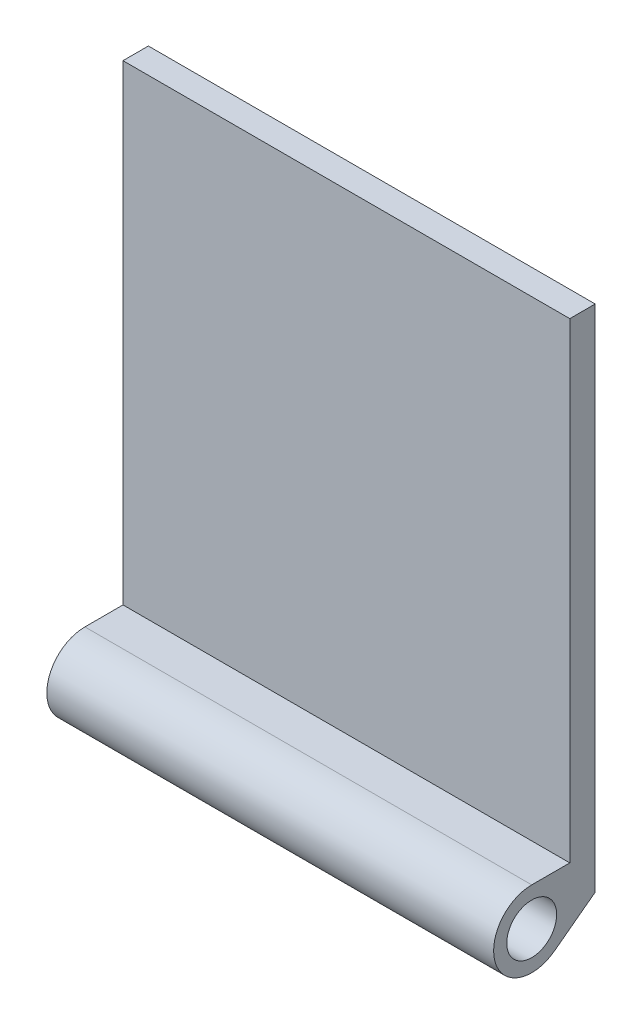
ISO-10303-21;
HEADER;
FILE_DESCRIPTION(('STEP AP214'),'2;1');
FILE_NAME('part.step','',(''),(''),'','','');
FILE_SCHEMA(('AUTOMOTIVE_DESIGN { 1 0 10303 214 1 1 1 1 }'));
ENDSEC;
DATA;
#1=APPLICATION_CONTEXT('core data for automotive mechanical design processes');
#2=APPLICATION_PROTOCOL_DEFINITION('international standard','automotive_design',2000,#1);
#3=PRODUCT_CONTEXT('',#1,'mechanical');
#4=PRODUCT('Part','Part','',(#3));
#5=PRODUCT_RELATED_PRODUCT_CATEGORY('part','',(#4));
#6=PRODUCT_DEFINITION_FORMATION('','',#4);
#7=PRODUCT_DEFINITION_CONTEXT('part definition',#1,'design');
#8=PRODUCT_DEFINITION('design','',#6,#7);
#9=PRODUCT_DEFINITION_SHAPE('','',#8);
#10=(LENGTH_UNIT() NAMED_UNIT(*) SI_UNIT(.MILLI.,.METRE.));
#11=(NAMED_UNIT(*) PLANE_ANGLE_UNIT() SI_UNIT($,.RADIAN.));
#12=(NAMED_UNIT(*) SI_UNIT($,.STERADIAN.) SOLID_ANGLE_UNIT());
#13=UNCERTAINTY_MEASURE_WITH_UNIT(LENGTH_MEASURE(1.E-05),#10,'distance_accuracy_value','');
#14=(GEOMETRIC_REPRESENTATION_CONTEXT(3) GLOBAL_UNCERTAINTY_ASSIGNED_CONTEXT((#13)) GLOBAL_UNIT_ASSIGNED_CONTEXT((#10,
#11,#12)) REPRESENTATION_CONTEXT('',''));
#15=CARTESIAN_POINT('',(0.,0.,0.));
#16=DIRECTION('',(0.,0.,1.));
#17=DIRECTION('',(1.,0.,0.));
#18=AXIS2_PLACEMENT_3D('',#15,#16,#17);
#19=CARTESIAN_POINT('',(0.919367588932834,8.0901185770751,1.5));
#20=DIRECTION('',(1.,0.,0.));
#21=DIRECTION('',(0.,1.,0.));
#22=AXIS2_PLACEMENT_3D('',#19,#20,#21);
#23=PLANE('',#22);
#24=DIRECTION('',(0.,-1.,0.));
#25=VECTOR('',#24,1.);
#26=CARTESIAN_POINT('',(0.919367588932834,8.0901185770751,0.));
#27=LINE('',#26,#25);
#28=CARTESIAN_POINT('',(0.919367588932834,8.0901185770751,0.));
#29=VERTEX_POINT('',#28);
#30=CARTESIAN_POINT('',(0.919367588932841,-22.0098814229249,0.));
#31=VERTEX_POINT('',#30);
#32=EDGE_CURVE('E121',#29,#31,#27,.T.);
#33=ORIENTED_EDGE('',*,*,#32,.T.);
#34=DIRECTION('',(0.,-0.5999426539581,0.800043006320105));
#35=VECTOR('',#34,1.);
#36=CARTESIAN_POINT('',(0.919367588932841,-22.0098814229249,0.));
#37=LINE('',#36,#35);
#38=CARTESIAN_POINT('',(0.919367588932841,-23.8097093920236,2.40012902859428));
#39=VERTEX_POINT('',#38);
#40=EDGE_CURVE('E147',#31,#39,#37,.T.);
#41=ORIENTED_EDGE('',*,*,#40,.T.);
#42=CARTESIAN_POINT('',(0.919367588932841,-22.0096126278034,3.75));
#43=DIRECTION('',(1.,0.,0.));
#44=DIRECTION('',(0.,1.,0.));
#45=AXIS2_PLACEMENT_3D('',#42,#43,#44);
#46=CIRCLE('',#45,2.25);
#47=CARTESIAN_POINT('',(0.91936758893284,-19.7596126278034,3.75));
#48=VERTEX_POINT('',#47);
#49=EDGE_CURVE('E115',#39,#48,#46,.F.);
#50=ORIENTED_EDGE('',*,*,#49,.T.);
#51=DIRECTION('',(0.,0.,-1.));
#52=VECTOR('',#51,1.);
#53=CARTESIAN_POINT('',(0.91936758893284,-19.7596126278034,3.75));
#54=LINE('',#53,#52);
#55=CARTESIAN_POINT('',(0.91936758893284,-19.7596126278034,1.5));
#56=VERTEX_POINT('',#55);
#57=EDGE_CURVE('E90',#48,#56,#54,.T.);
#58=ORIENTED_EDGE('',*,*,#57,.T.);
#59=DIRECTION('',(0.,-1.,0.));
#60=VECTOR('',#59,1.);
#61=CARTESIAN_POINT('',(0.919367588932834,8.0901185770751,1.5));
#62=LINE('',#61,#60);
#63=CARTESIAN_POINT('',(0.919367588932834,8.0901185770751,1.5));
#64=VERTEX_POINT('',#63);
#65=EDGE_CURVE('E52',#64,#56,#62,.T.);
#66=ORIENTED_EDGE('',*,*,#65,.F.);
#67=DIRECTION('',(0.,0.,-1.));
#68=VECTOR('',#67,1.);
#69=CARTESIAN_POINT('',(0.919367588932834,8.0901185770751,1.5));
#70=LINE('',#69,#68);
#71=EDGE_CURVE('E40',#64,#29,#70,.T.);
#72=ORIENTED_EDGE('',*,*,#71,.T.);
#73=EDGE_LOOP('',(#33,#41,#50,#58,#66,#72));
#74=FACE_BOUND('',#73,.T.);
#75=CARTESIAN_POINT('',(0.919367588932841,-22.0096126278034,3.75));
#76=DIRECTION('',(1.,0.,0.));
#77=DIRECTION('',(0.,1.,0.));
#78=AXIS2_PLACEMENT_3D('',#75,#76,#77);
#79=CIRCLE('',#78,1.475);
#80=CARTESIAN_POINT('',(0.91936758893284,-20.5346126278034,3.75));
#81=VERTEX_POINT('',#80);
#82=EDGE_CURVE('E118',#81,#81,#79,.F.);
#83=ORIENTED_EDGE('',*,*,#82,.F.);
#84=EDGE_LOOP('',(#83));
#85=FACE_BOUND('',#84,.T.);
#86=ADVANCED_FACE('F33',(#74,#85),#23,.F.);
#87=CARTESIAN_POINT('',(27.3193675889328,8.0901185770751,1.5));
#88=DIRECTION('',(-1.,0.,0.));
#89=DIRECTION('',(0.,0.,1.));
#90=AXIS2_PLACEMENT_3D('',#87,#88,#89);
#91=PLANE('',#90);
#92=DIRECTION('',(0.,0.5999426539581,-0.800043006320105));
#93=VECTOR('',#92,1.);
#94=CARTESIAN_POINT('',(27.3193675889328,-22.0098814229249,0.));
#95=LINE('',#94,#93);
#96=CARTESIAN_POINT('',(27.3193675889328,-23.8097093920236,2.40012902859428));
#97=VERTEX_POINT('',#96);
#98=CARTESIAN_POINT('',(27.3193675889328,-22.0098814229249,0.));
#99=VERTEX_POINT('',#98);
#100=EDGE_CURVE('E102',#97,#99,#95,.T.);
#101=ORIENTED_EDGE('',*,*,#100,.T.);
#102=DIRECTION('',(0.,1.,0.));
#103=VECTOR('',#102,1.);
#104=CARTESIAN_POINT('',(27.3193675889328,8.0901185770751,0.));
#105=LINE('',#104,#103);
#106=CARTESIAN_POINT('',(27.3193675889328,8.0901185770751,0.));
#107=VERTEX_POINT('',#106);
#108=EDGE_CURVE('E132',#99,#107,#105,.T.);
#109=ORIENTED_EDGE('',*,*,#108,.T.);
#110=DIRECTION('',(0.,0.,-1.));
#111=VECTOR('',#110,1.);
#112=CARTESIAN_POINT('',(27.3193675889328,8.0901185770751,1.5));
#113=LINE('',#112,#111);
#114=CARTESIAN_POINT('',(27.3193675889328,8.0901185770751,1.5));
#115=VERTEX_POINT('',#114);
#116=EDGE_CURVE('E11',#115,#107,#113,.T.);
#117=ORIENTED_EDGE('',*,*,#116,.F.);
#118=DIRECTION('',(0.,1.,0.));
#119=VECTOR('',#118,1.);
#120=CARTESIAN_POINT('',(27.3193675889328,8.0901185770751,1.5));
#121=LINE('',#120,#119);
#122=CARTESIAN_POINT('',(27.3193675889328,-19.7596126278034,1.5));
#123=VERTEX_POINT('',#122);
#124=EDGE_CURVE('E107',#123,#115,#121,.T.);
#125=ORIENTED_EDGE('',*,*,#124,.F.);
#126=DIRECTION('',(0.,0.,1.));
#127=VECTOR('',#126,1.);
#128=CARTESIAN_POINT('',(27.3193675889328,-19.7596126278034,3.75));
#129=LINE('',#128,#127);
#130=CARTESIAN_POINT('',(27.3193675889328,-19.7596126278034,3.75));
#131=VERTEX_POINT('',#130);
#132=EDGE_CURVE('E89',#123,#131,#129,.T.);
#133=ORIENTED_EDGE('',*,*,#132,.T.);
#134=CARTESIAN_POINT('',(27.3193675889328,-22.0096126278034,3.75));
#135=DIRECTION('',(1.,0.,0.));
#136=DIRECTION('',(0.,0.,-1.));
#137=AXIS2_PLACEMENT_3D('',#134,#135,#136);
#138=CIRCLE('',#137,2.25);
#139=EDGE_CURVE('E96',#131,#97,#138,.T.);
#140=ORIENTED_EDGE('',*,*,#139,.T.);
#141=EDGE_LOOP('',(#101,#109,#117,#125,#133,#140));
#142=FACE_BOUND('',#141,.T.);
#143=CARTESIAN_POINT('',(27.3193675889328,-22.0096126278034,3.75));
#144=DIRECTION('',(1.,0.,0.));
#145=DIRECTION('',(0.,0.,-1.));
#146=AXIS2_PLACEMENT_3D('',#143,#144,#145);
#147=CIRCLE('',#146,1.475);
#148=CARTESIAN_POINT('',(27.3193675889328,-22.0096126278034,2.275));
#149=VERTEX_POINT('',#148);
#150=EDGE_CURVE('E108',#149,#149,#147,.T.);
#151=ORIENTED_EDGE('',*,*,#150,.F.);
#152=EDGE_LOOP('',(#151));
#153=FACE_BOUND('',#152,.T.);
#154=ADVANCED_FACE('F104',(#142,#153),#91,.F.);
#155=CARTESIAN_POINT('',(0.919367588932834,8.0901185770751,1.5));
#156=DIRECTION('',(0.,-1.,0.));
#157=DIRECTION('',(0.,0.,-1.));
#158=AXIS2_PLACEMENT_3D('',#155,#156,#157);
#159=PLANE('',#158);
#160=DIRECTION('',(-1.,0.,0.));
#161=VECTOR('',#160,1.);
#162=CARTESIAN_POINT('',(0.919367588932834,8.0901185770751,0.));
#163=LINE('',#162,#161);
#164=EDGE_CURVE('E123',#107,#29,#163,.T.);
#165=ORIENTED_EDGE('',*,*,#164,.T.);
#166=ORIENTED_EDGE('',*,*,#71,.F.);
#167=DIRECTION('',(-1.,0.,0.));
#168=VECTOR('',#167,1.);
#169=CARTESIAN_POINT('',(0.919367588932834,8.0901185770751,1.5));
#170=LINE('',#169,#168);
#171=EDGE_CURVE('E125',#115,#64,#170,.T.);
#172=ORIENTED_EDGE('',*,*,#171,.F.);
#173=ORIENTED_EDGE('',*,*,#116,.T.);
#174=EDGE_LOOP('',(#165,#166,#172,#173));
#175=FACE_BOUND('',#174,.T.);
#176=ADVANCED_FACE('F148',(#175),#159,.F.);
#177=CARTESIAN_POINT('',(0.,0.,1.5));
#178=DIRECTION('',(0.,0.,1.));
#179=DIRECTION('',(1.,0.,0.));
#180=AXIS2_PLACEMENT_3D('',#177,#178,#179);
#181=PLANE('',#180);
#182=DIRECTION('',(1.,0.,0.));
#183=VECTOR('',#182,1.);
#184=CARTESIAN_POINT('',(-6.58063241106715,-19.7596126278034,1.5));
#185=LINE('',#184,#183);
#186=EDGE_CURVE('E47',#56,#123,#185,.T.);
#187=ORIENTED_EDGE('',*,*,#186,.T.);
#188=ORIENTED_EDGE('',*,*,#124,.T.);
#189=ORIENTED_EDGE('',*,*,#171,.T.);
#190=ORIENTED_EDGE('',*,*,#65,.T.);
#191=EDGE_LOOP('',(#187,#188,#189,#190));
#192=FACE_BOUND('',#191,.T.);
#193=ADVANCED_FACE('F149',(#192),#181,.T.);
#194=CARTESIAN_POINT('',(0.,0.,0.));
#195=DIRECTION('',(0.,0.,1.));
#196=DIRECTION('',(1.,0.,0.));
#197=AXIS2_PLACEMENT_3D('',#194,#195,#196);
#198=PLANE('',#197);
#199=ORIENTED_EDGE('',*,*,#32,.F.);
#200=ORIENTED_EDGE('',*,*,#164,.F.);
#201=ORIENTED_EDGE('',*,*,#108,.F.);
#202=DIRECTION('',(1.,0.,0.));
#203=VECTOR('',#202,1.);
#204=CARTESIAN_POINT('',(0.919367588932841,-22.0098814229249,0.));
#205=LINE('',#204,#203);
#206=EDGE_CURVE('E129',#31,#99,#205,.T.);
#207=ORIENTED_EDGE('',*,*,#206,.F.);
#208=EDGE_LOOP('',(#199,#200,#201,#207));
#209=FACE_BOUND('',#208,.T.);
#210=ADVANCED_FACE('F144',(#209),#198,.F.);
#211=CARTESIAN_POINT('',(-6.58063241106715,-19.7596126278034,3.75));
#212=DIRECTION('',(0.,1.,0.));
#213=DIRECTION('',(0.,0.,1.));
#214=AXIS2_PLACEMENT_3D('',#211,#212,#213);
#215=PLANE('',#214);
#216=ORIENTED_EDGE('',*,*,#57,.F.);
#217=DIRECTION('',(1.,0.,0.));
#218=VECTOR('',#217,1.);
#219=CARTESIAN_POINT('',(-6.58063241106715,-19.7596126278034,3.75));
#220=LINE('',#219,#218);
#221=EDGE_CURVE('E85',#48,#131,#220,.T.);
#222=ORIENTED_EDGE('',*,*,#221,.T.);
#223=ORIENTED_EDGE('',*,*,#132,.F.);
#224=ORIENTED_EDGE('',*,*,#186,.F.);
#225=EDGE_LOOP('',(#216,#222,#223,#224));
#226=FACE_BOUND('',#225,.T.);
#227=ADVANCED_FACE('F87',(#226),#215,.T.);
#228=CARTESIAN_POINT('',(-6.58063241106715,-22.0096126278034,3.75));
#229=DIRECTION('',(1.,0.,0.));
#230=DIRECTION('',(0.,0.,-1.));
#231=AXIS2_PLACEMENT_3D('',#228,#229,#230);
#232=CYLINDRICAL_SURFACE('',#231,2.25);
#233=ORIENTED_EDGE('',*,*,#49,.F.);
#234=DIRECTION('',(1.,0.,0.));
#235=VECTOR('',#234,1.);
#236=CARTESIAN_POINT('',(-6.58063241106715,-23.8097093920236,2.40012902859428));
#237=LINE('',#236,#235);
#238=EDGE_CURVE('E93',#39,#97,#237,.T.);
#239=ORIENTED_EDGE('',*,*,#238,.T.);
#240=ORIENTED_EDGE('',*,*,#139,.F.);
#241=ORIENTED_EDGE('',*,*,#221,.F.);
#242=EDGE_LOOP('',(#233,#239,#240,#241));
#243=FACE_BOUND('',#242,.T.);
#244=ADVANCED_FACE('F97',(#243),#232,.T.);
#245=CARTESIAN_POINT('',(-6.58063241106715,-22.0098814229249,0.));
#246=DIRECTION('',(0.,-0.800043006320105,-0.5999426539581));
#247=DIRECTION('',(0.,0.5999426539581,-0.800043006320105));
#248=AXIS2_PLACEMENT_3D('',#245,#246,#247);
#249=PLANE('',#248);
#250=ORIENTED_EDGE('',*,*,#40,.F.);
#251=ORIENTED_EDGE('',*,*,#206,.T.);
#252=ORIENTED_EDGE('',*,*,#100,.F.);
#253=ORIENTED_EDGE('',*,*,#238,.F.);
#254=EDGE_LOOP('',(#250,#251,#252,#253));
#255=FACE_BOUND('',#254,.T.);
#256=ADVANCED_FACE('F146',(#255),#249,.T.);
#257=CARTESIAN_POINT('',(-6.58063241106715,-22.0096126278034,3.75));
#258=DIRECTION('',(1.,0.,0.));
#259=DIRECTION('',(0.,0.,-1.));
#260=AXIS2_PLACEMENT_3D('',#257,#258,#259);
#261=CYLINDRICAL_SURFACE('',#260,1.475);
#262=ORIENTED_EDGE('',*,*,#82,.T.);
#263=EDGE_LOOP('',(#262));
#264=FACE_BOUND('',#263,.T.);
#265=ORIENTED_EDGE('',*,*,#150,.T.);
#266=EDGE_LOOP('',(#265));
#267=FACE_BOUND('',#266,.T.);
#268=ADVANCED_FACE('F209',(#264,#267),#261,.F.);
#269=CLOSED_SHELL('',(#86,#154,#176,#193,#210,#227,#244,#256,#268));
#270=MANIFOLD_SOLID_BREP('B2',#269);
#271=ADVANCED_BREP_SHAPE_REPRESENTATION('',(#18,#270),#14);
#272=SHAPE_DEFINITION_REPRESENTATION(#9,#271);
ENDSEC;
END-ISO-10303-21;
